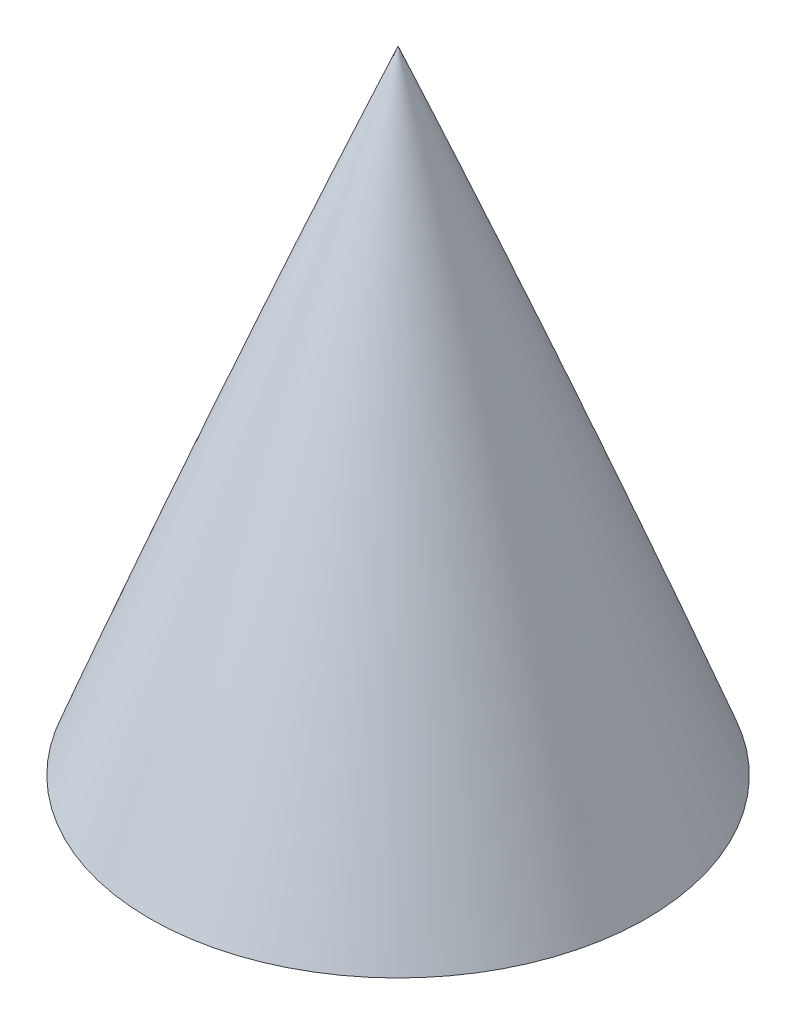
ISO-10303-21;
HEADER;
FILE_DESCRIPTION(('STEP AP214'),'2;1');
FILE_NAME('part.step','',(''),(''),'','','');
FILE_SCHEMA(('AUTOMOTIVE_DESIGN { 1 0 10303 214 1 1 1 1 }'));
ENDSEC;
DATA;
#1=APPLICATION_CONTEXT('core data for automotive mechanical design processes');
#2=APPLICATION_PROTOCOL_DEFINITION('international standard','automotive_design',2000,#1);
#3=PRODUCT_CONTEXT('',#1,'mechanical');
#4=PRODUCT('Part','Part','',(#3));
#5=PRODUCT_RELATED_PRODUCT_CATEGORY('part','',(#4));
#6=PRODUCT_DEFINITION_FORMATION('','',#4);
#7=PRODUCT_DEFINITION_CONTEXT('part definition',#1,'design');
#8=PRODUCT_DEFINITION('design','',#6,#7);
#9=PRODUCT_DEFINITION_SHAPE('','',#8);
#10=(LENGTH_UNIT() NAMED_UNIT(*) SI_UNIT(.MILLI.,.METRE.));
#11=(NAMED_UNIT(*) PLANE_ANGLE_UNIT() SI_UNIT($,.RADIAN.));
#12=(NAMED_UNIT(*) SI_UNIT($,.STERADIAN.) SOLID_ANGLE_UNIT());
#13=UNCERTAINTY_MEASURE_WITH_UNIT(LENGTH_MEASURE(1.E-05),#10,'distance_accuracy_value','');
#14=(GEOMETRIC_REPRESENTATION_CONTEXT(3) GLOBAL_UNCERTAINTY_ASSIGNED_CONTEXT((#13)) GLOBAL_UNIT_ASSIGNED_CONTEXT((#10,
#11,#12)) REPRESENTATION_CONTEXT('',''));
#15=CARTESIAN_POINT('',(0.,0.,0.));
#16=DIRECTION('',(0.,0.,1.));
#17=DIRECTION('',(1.,0.,0.));
#18=AXIS2_PLACEMENT_3D('',#15,#16,#17);
#19=CARTESIAN_POINT('',(0.,366.489212170568,0.));
#20=DIRECTION('',(0.,1.,0.));
#21=DIRECTION('',(0.,0.,1.));
#22=AXIS2_PLACEMENT_3D('',#19,#20,#21);
#23=PLANE('',#22);
#24=CARTESIAN_POINT('',(0.,366.489212170568,0.));
#25=DIRECTION('',(0.,1.,0.));
#26=DIRECTION('',(0.,0.,1.));
#27=AXIS2_PLACEMENT_3D('',#24,#25,#26);
#28=CIRCLE('',#27,8.5941287492407);
#29=CARTESIAN_POINT('',(0.,366.489212170568,8.5941287492407));
#30=VERTEX_POINT('',#29);
#31=EDGE_CURVE('E47',#30,#30,#28,.T.);
#32=ORIENTED_EDGE('',*,*,#31,.T.);
#33=EDGE_LOOP('',(#32));
#34=FACE_BOUND('',#33,.T.);
#35=CARTESIAN_POINT('',(0.,366.489212170568,0.));
#36=DIRECTION('',(0.,1.,0.));
#37=DIRECTION('',(0.,0.,1.));
#38=AXIS2_PLACEMENT_3D('',#35,#36,#37);
#39=CIRCLE('',#38,11.7993764636706);
#40=CARTESIAN_POINT('',(0.,366.489212170568,11.7993764636706));
#41=VERTEX_POINT('',#40);
#42=EDGE_CURVE('E12',#41,#41,#39,.T.);
#43=ORIENTED_EDGE('',*,*,#42,.F.);
#44=EDGE_LOOP('',(#43));
#45=FACE_BOUND('',#44,.T.);
#46=ADVANCED_FACE('F39',(#34,#45),#23,.F.);
#47=CARTESIAN_POINT('',(0.,-1.11022302462516E-13,-964.039392901324));
#48=DIRECTION('',(-1.,0.,0.));
#49=DIRECTION('',(0.,0.,1.));
#50=AXIS2_PLACEMENT_3D('',#47,#48,#49);
#51=CIRCLE('',#50,1042.38939290132);
#52=TRIMMED_CURVE('',#51,(PARAMETER_VALUE(-0.390191728322816)),
(PARAMETER_VALUE(0.390191728322816)),.T.,.PARAMETER.);
#53=CARTESIAN_POINT('',(0.,-1.11022302462516E-13,0.));
#54=DIRECTION('',(0.,1.,0.));
#55=AXIS1_PLACEMENT('',#53,#54);
#56=SURFACE_OF_REVOLUTION('',#52,#55);
#57=ORIENTED_EDGE('',*,*,#42,.T.);
#58=EDGE_LOOP('',(#57));
#59=FACE_BOUND('',#58,.T.);
#60=CARTESIAN_POINT('',(-1.11022302462516E-13,396.489212170568,0.));
#61=VERTEX_POINT('',#60);
#62=VERTEX_LOOP('',#61);
#63=FACE_BOUND('',#62,.T.);
#64=ADVANCED_FACE('F55',(#59,#63),#56,.T.);
#65=CARTESIAN_POINT('',(0.,-1.11022302462516E-13,-964.039392901324));
#66=DIRECTION('',(-1.,0.,0.));
#67=DIRECTION('',(0.,0.,1.));
#68=AXIS2_PLACEMENT_3D('',#65,#66,#67);
#69=CIRCLE('',#68,1039.38939290132);
#70=TRIMMED_CURVE('',#69,(PARAMETER_VALUE(-0.383112862193113)),
(PARAMETER_VALUE(0.383112862193113)),.T.,.PARAMETER.);
#71=CARTESIAN_POINT('',(0.,-1.11022302462516E-13,0.));
#72=DIRECTION('',(0.,1.,0.));
#73=AXIS1_PLACEMENT('',#71,#72);
#74=SURFACE_OF_REVOLUTION('',#70,#73);
#75=ORIENTED_EDGE('',*,*,#31,.F.);
#76=EDGE_LOOP('',(#75));
#77=FACE_BOUND('',#76,.T.);
#78=CARTESIAN_POINT('',(0.,388.533600876719,0.));
#79=VERTEX_POINT('',#78);
#80=VERTEX_LOOP('',#79);
#81=FACE_BOUND('',#80,.T.);
#82=ADVANCED_FACE('F53',(#77,#81),#74,.F.);
#83=CLOSED_SHELL('',(#46,#64,#82));
#84=MANIFOLD_SOLID_BREP('B2',#83);
#85=ADVANCED_BREP_SHAPE_REPRESENTATION('',(#18,#84),#14);
#86=SHAPE_DEFINITION_REPRESENTATION(#9,#85);
ENDSEC;
END-ISO-10303-21;
